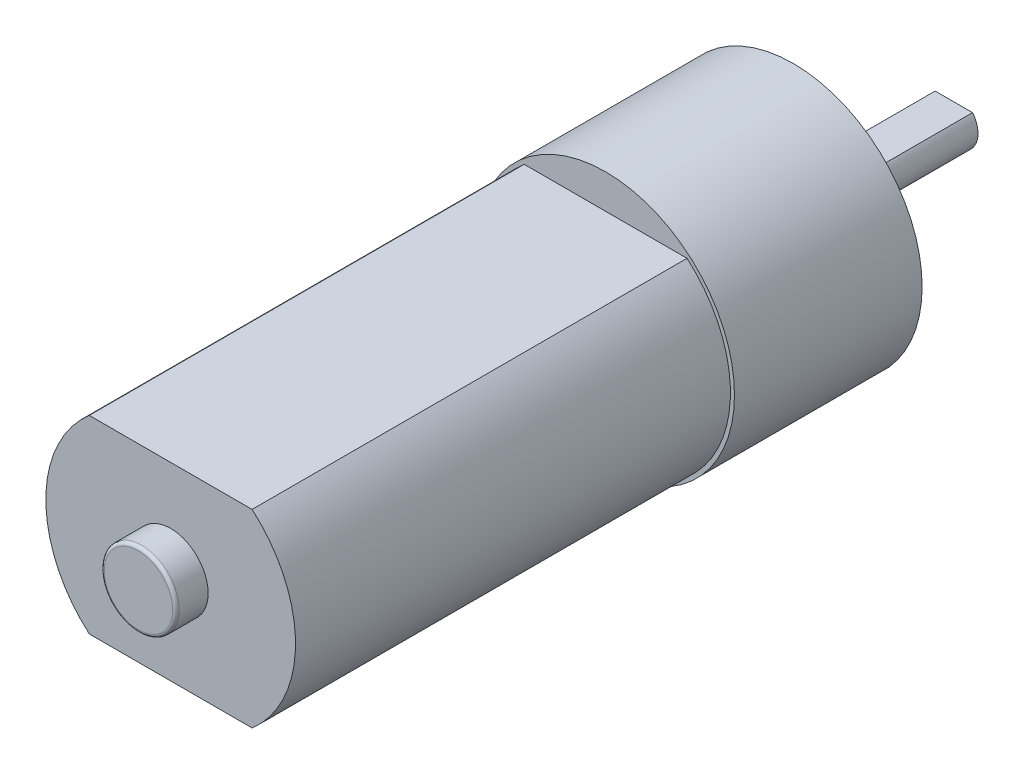
ISO-10303-21;
HEADER;
FILE_DESCRIPTION(('STEP AP214'),'2;1');
FILE_NAME('part.step','',(''),(''),'','','');
FILE_SCHEMA(('AUTOMOTIVE_DESIGN { 1 0 10303 214 1 1 1 1 }'));
ENDSEC;
DATA;
#1=APPLICATION_CONTEXT('core data for automotive mechanical design processes');
#2=APPLICATION_PROTOCOL_DEFINITION('international standard','automotive_design',2000,#1);
#3=PRODUCT_CONTEXT('',#1,'mechanical');
#4=PRODUCT('Part','Part','',(#3));
#5=PRODUCT_RELATED_PRODUCT_CATEGORY('part','',(#4));
#6=PRODUCT_DEFINITION_FORMATION('','',#4);
#7=PRODUCT_DEFINITION_CONTEXT('part definition',#1,'design');
#8=PRODUCT_DEFINITION('design','',#6,#7);
#9=PRODUCT_DEFINITION_SHAPE('','',#8);
#10=(LENGTH_UNIT() NAMED_UNIT(*) SI_UNIT(.MILLI.,.METRE.));
#11=(NAMED_UNIT(*) PLANE_ANGLE_UNIT() SI_UNIT($,.RADIAN.));
#12=(NAMED_UNIT(*) SI_UNIT($,.STERADIAN.) SOLID_ANGLE_UNIT());
#13=UNCERTAINTY_MEASURE_WITH_UNIT(LENGTH_MEASURE(1.E-05),#10,'distance_accuracy_value','');
#14=(GEOMETRIC_REPRESENTATION_CONTEXT(3) GLOBAL_UNCERTAINTY_ASSIGNED_CONTEXT((#13)) GLOBAL_UNIT_ASSIGNED_CONTEXT((#10,
#11,#12)) REPRESENTATION_CONTEXT('',''));
#15=CARTESIAN_POINT('',(0.,0.,0.));
#16=DIRECTION('',(0.,0.,1.));
#17=DIRECTION('',(1.,0.,0.));
#18=AXIS2_PLACEMENT_3D('',#15,#16,#17);
#19=CARTESIAN_POINT('',(0.,0.,38.65));
#20=DIRECTION('',(0.,0.,1.));
#21=DIRECTION('',(1.,0.,0.));
#22=AXIS2_PLACEMENT_3D('',#19,#20,#21);
#23=PLANE('',#22);
#24=CARTESIAN_POINT('',(0.,0.,38.65));
#25=DIRECTION('',(0.,0.,1.));
#26=DIRECTION('',(1.,0.,0.));
#27=AXIS2_PLACEMENT_3D('',#24,#25,#26);
#28=CIRCLE('',#27,7.75);
#29=CARTESIAN_POINT('',(5.05439165478893,-5.875,38.65));
#30=VERTEX_POINT('',#29);
#31=CARTESIAN_POINT('',(5.05439165478893,5.875,38.65));
#32=VERTEX_POINT('',#31);
#33=EDGE_CURVE('E137',#30,#32,#28,.T.);
#34=ORIENTED_EDGE('',*,*,#33,.T.);
#35=DIRECTION('',(-1.,0.,0.));
#36=VECTOR('',#35,1.);
#37=CARTESIAN_POINT('',(-5.05439165478893,5.875,38.65));
#38=LINE('',#37,#36);
#39=CARTESIAN_POINT('',(-5.05439165478893,5.875,38.65));
#40=VERTEX_POINT('',#39);
#41=EDGE_CURVE('E119',#32,#40,#38,.T.);
#42=ORIENTED_EDGE('',*,*,#41,.T.);
#43=CARTESIAN_POINT('',(-5.05439165478893,-5.875,38.65));
#44=VERTEX_POINT('',#43);
#45=EDGE_CURVE('E141',#40,#44,#28,.T.);
#46=ORIENTED_EDGE('',*,*,#45,.T.);
#47=DIRECTION('',(-1.,0.,0.));
#48=VECTOR('',#47,1.);
#49=CARTESIAN_POINT('',(-5.05439165478893,-5.875,38.65));
#50=LINE('',#49,#48);
#51=EDGE_CURVE('E126',#30,#44,#50,.T.);
#52=ORIENTED_EDGE('',*,*,#51,.F.);
#53=EDGE_LOOP('',(#34,#42,#46,#52));
#54=FACE_BOUND('',#53,.T.);
#55=CARTESIAN_POINT('',(0.,0.,38.65));
#56=DIRECTION('',(0.,0.,1.));
#57=DIRECTION('',(1.,0.,0.));
#58=AXIS2_PLACEMENT_3D('',#55,#56,#57);
#59=CIRCLE('',#58,2.325);
#60=CARTESIAN_POINT('',(2.325,0.,38.65));
#61=VERTEX_POINT('',#60);
#62=EDGE_CURVE('E116',#61,#61,#59,.T.);
#63=ORIENTED_EDGE('',*,*,#62,.F.);
#64=EDGE_LOOP('',(#63));
#65=FACE_BOUND('',#64,.T.);
#66=ADVANCED_FACE('F37',(#54,#65),#23,.T.);
#67=CARTESIAN_POINT('',(0.,0.,38.65));
#68=DIRECTION('',(0.,0.,-1.));
#69=DIRECTION('',(-1.,0.,0.));
#70=AXIS2_PLACEMENT_3D('',#67,#68,#69);
#71=CYLINDRICAL_SURFACE('',#70,7.75);
#72=DIRECTION('',(0.,0.,1.));
#73=VECTOR('',#72,1.);
#74=CARTESIAN_POINT('',(5.05439165478893,5.875,11.65));
#75=LINE('',#74,#73);
#76=CARTESIAN_POINT('',(5.05439165478893,5.875,11.65));
#77=VERTEX_POINT('',#76);
#78=EDGE_CURVE('E123',#77,#32,#75,.T.);
#79=ORIENTED_EDGE('',*,*,#78,.T.);
#80=ORIENTED_EDGE('',*,*,#33,.F.);
#81=DIRECTION('',(0.,0.,1.));
#82=VECTOR('',#81,1.);
#83=CARTESIAN_POINT('',(5.05439165478893,-5.875,11.65));
#84=LINE('',#83,#82);
#85=CARTESIAN_POINT('',(5.05439165478893,-5.875,11.65));
#86=VERTEX_POINT('',#85);
#87=EDGE_CURVE('E60',#86,#30,#84,.T.);
#88=ORIENTED_EDGE('',*,*,#87,.F.);
#89=CARTESIAN_POINT('',(0.,0.,11.65));
#90=DIRECTION('',(0.,0.,1.));
#91=DIRECTION('',(1.,0.,0.));
#92=AXIS2_PLACEMENT_3D('',#89,#90,#91);
#93=CIRCLE('',#92,7.75);
#94=EDGE_CURVE('E142',#86,#77,#93,.T.);
#95=ORIENTED_EDGE('',*,*,#94,.T.);
#96=EDGE_LOOP('',(#79,#80,#88,#95));
#97=FACE_BOUND('',#96,.T.);
#98=ADVANCED_FACE('F192',(#97),#71,.T.);
#99=DIRECTION('',(0.,0.,1.));
#100=VECTOR('',#99,1.);
#101=CARTESIAN_POINT('',(-5.05439165478893,5.875,11.65));
#102=LINE('',#101,#100);
#103=CARTESIAN_POINT('',(-5.05439165478893,5.875,11.65));
#104=VERTEX_POINT('',#103);
#105=EDGE_CURVE('E52',#104,#40,#102,.T.);
#106=ORIENTED_EDGE('',*,*,#105,.F.);
#107=CARTESIAN_POINT('',(-5.05439165478893,-5.875,11.65));
#108=VERTEX_POINT('',#107);
#109=EDGE_CURVE('E135',#104,#108,#93,.T.);
#110=ORIENTED_EDGE('',*,*,#109,.T.);
#111=DIRECTION('',(0.,0.,1.));
#112=VECTOR('',#111,1.);
#113=CARTESIAN_POINT('',(-5.05439165478893,-5.875,11.65));
#114=LINE('',#113,#112);
#115=EDGE_CURVE('E132',#108,#44,#114,.T.);
#116=ORIENTED_EDGE('',*,*,#115,.T.);
#117=ORIENTED_EDGE('',*,*,#45,.F.);
#118=EDGE_LOOP('',(#106,#110,#116,#117));
#119=FACE_BOUND('',#118,.T.);
#120=ADVANCED_FACE('F200',(#119),#71,.T.);
#121=CARTESIAN_POINT('',(0.,0.,11.65));
#122=DIRECTION('',(0.,0.,1.));
#123=DIRECTION('',(1.,0.,0.));
#124=AXIS2_PLACEMENT_3D('',#121,#122,#123);
#125=PLANE('',#124);
#126=CARTESIAN_POINT('',(0.,0.,11.65));
#127=DIRECTION('',(0.,0.,1.));
#128=DIRECTION('',(1.,0.,0.));
#129=AXIS2_PLACEMENT_3D('',#126,#127,#128);
#130=CIRCLE('',#129,8.);
#131=CARTESIAN_POINT('',(8.,0.,11.65));
#132=VERTEX_POINT('',#131);
#133=EDGE_CURVE('E164',#132,#132,#130,.T.);
#134=ORIENTED_EDGE('',*,*,#133,.T.);
#135=EDGE_LOOP('',(#134));
#136=FACE_BOUND('',#135,.T.);
#137=ORIENTED_EDGE('',*,*,#109,.F.);
#138=DIRECTION('',(-1.,0.,0.));
#139=VECTOR('',#138,1.);
#140=CARTESIAN_POINT('',(-5.05439165478893,5.875,11.65));
#141=LINE('',#140,#139);
#142=EDGE_CURVE('E120',#77,#104,#141,.T.);
#143=ORIENTED_EDGE('',*,*,#142,.F.);
#144=ORIENTED_EDGE('',*,*,#94,.F.);
#145=DIRECTION('',(-1.,0.,0.));
#146=VECTOR('',#145,1.);
#147=CARTESIAN_POINT('',(-5.05439165478893,-5.875,11.65));
#148=LINE('',#147,#146);
#149=EDGE_CURVE('E128',#86,#108,#148,.T.);
#150=ORIENTED_EDGE('',*,*,#149,.T.);
#151=EDGE_LOOP('',(#137,#143,#144,#150));
#152=FACE_BOUND('',#151,.T.);
#153=ADVANCED_FACE('F229',(#136,#152),#125,.T.);
#154=CARTESIAN_POINT('',(0.,0.,-1.82));
#155=DIRECTION('',(0.,0.,-1.));
#156=DIRECTION('',(-1.,0.,0.));
#157=AXIS2_PLACEMENT_3D('',#154,#155,#156);
#158=PLANE('',#157);
#159=CARTESIAN_POINT('',(0.,0.,-1.82));
#160=DIRECTION('',(0.,0.,-1.));
#161=DIRECTION('',(-1.,0.,0.));
#162=AXIS2_PLACEMENT_3D('',#159,#160,#161);
#163=CIRCLE('',#162,2.975);
#164=CARTESIAN_POINT('',(-2.975,0.,-1.82));
#165=VERTEX_POINT('',#164);
#166=EDGE_CURVE('E158',#165,#165,#163,.T.);
#167=ORIENTED_EDGE('',*,*,#166,.T.);
#168=EDGE_LOOP('',(#167));
#169=FACE_BOUND('',#168,.T.);
#170=CARTESIAN_POINT('',(0.,0.,-1.82));
#171=DIRECTION('',(0.,0.,-1.));
#172=DIRECTION('',(-1.,0.,0.));
#173=AXIS2_PLACEMENT_3D('',#170,#171,#172);
#174=CIRCLE('',#173,1.5);
#175=CARTESIAN_POINT('',(-1.5,0.,-1.82));
#176=VERTEX_POINT('',#175);
#177=EDGE_CURVE('E153',#176,#176,#174,.T.);
#178=ORIENTED_EDGE('',*,*,#177,.F.);
#179=EDGE_LOOP('',(#178));
#180=FACE_BOUND('',#179,.T.);
#181=ADVANCED_FACE('F225',(#169,#180),#158,.T.);
#182=CARTESIAN_POINT('',(0.,0.,0.));
#183=DIRECTION('',(0.,0.,1.));
#184=DIRECTION('',(1.,0.,0.));
#185=AXIS2_PLACEMENT_3D('',#182,#183,#184);
#186=PLANE('',#185);
#187=CARTESIAN_POINT('',(5.5,0.,0.));
#188=DIRECTION('',(0.,0.,-1.));
#189=DIRECTION('',(-1.,0.,0.));
#190=AXIS2_PLACEMENT_3D('',#187,#188,#189);
#191=CIRCLE('',#190,0.799999999999999);
#192=CARTESIAN_POINT('',(4.7,0.,0.));
#193=VERTEX_POINT('',#192);
#194=EDGE_CURVE('E106',#193,#193,#191,.T.);
#195=ORIENTED_EDGE('',*,*,#194,.F.);
#196=EDGE_LOOP('',(#195));
#197=FACE_BOUND('',#196,.T.);
#198=CARTESIAN_POINT('',(-5.5,0.,0.));
#199=DIRECTION('',(0.,0.,-1.));
#200=DIRECTION('',(-1.,0.,0.));
#201=AXIS2_PLACEMENT_3D('',#198,#199,#200);
#202=CIRCLE('',#201,0.799999999999999);
#203=CARTESIAN_POINT('',(-6.3,0.,0.));
#204=VERTEX_POINT('',#203);
#205=EDGE_CURVE('E105',#204,#204,#202,.T.);
#206=ORIENTED_EDGE('',*,*,#205,.F.);
#207=EDGE_LOOP('',(#206));
#208=FACE_BOUND('',#207,.T.);
#209=CARTESIAN_POINT('',(0.,0.,0.));
#210=DIRECTION('',(0.,0.,1.));
#211=DIRECTION('',(1.,0.,0.));
#212=AXIS2_PLACEMENT_3D('',#209,#210,#211);
#213=CIRCLE('',#212,8.);
#214=CARTESIAN_POINT('',(8.,0.,0.));
#215=VERTEX_POINT('',#214);
#216=EDGE_CURVE('E163',#215,#215,#213,.T.);
#217=ORIENTED_EDGE('',*,*,#216,.F.);
#218=EDGE_LOOP('',(#217));
#219=FACE_BOUND('',#218,.T.);
#220=CARTESIAN_POINT('',(0.,0.,0.));
#221=DIRECTION('',(0.,0.,1.));
#222=DIRECTION('',(1.,0.,0.));
#223=AXIS2_PLACEMENT_3D('',#220,#221,#222);
#224=CIRCLE('',#223,2.975);
#225=CARTESIAN_POINT('',(2.975,0.,0.));
#226=VERTEX_POINT('',#225);
#227=EDGE_CURVE('E167',#226,#226,#224,.F.);
#228=ORIENTED_EDGE('',*,*,#227,.F.);
#229=EDGE_LOOP('',(#228));
#230=FACE_BOUND('',#229,.T.);
#231=ADVANCED_FACE('F228',(#197,#208,#219,#230),#186,.F.);
#232=CARTESIAN_POINT('',(0.,0.,11.65));
#233=DIRECTION('',(0.,0.,-1.));
#234=DIRECTION('',(-1.,0.,0.));
#235=AXIS2_PLACEMENT_3D('',#232,#233,#234);
#236=CYLINDRICAL_SURFACE('',#235,8.);
#237=ORIENTED_EDGE('',*,*,#133,.F.);
#238=EDGE_LOOP('',(#237));
#239=FACE_BOUND('',#238,.T.);
#240=ORIENTED_EDGE('',*,*,#216,.T.);
#241=EDGE_LOOP('',(#240));
#242=FACE_BOUND('',#241,.T.);
#243=ADVANCED_FACE('F233',(#239,#242),#236,.T.);
#244=CARTESIAN_POINT('',(0.,0.,-1.82));
#245=DIRECTION('',(0.,0.,1.));
#246=DIRECTION('',(1.,0.,0.));
#247=AXIS2_PLACEMENT_3D('',#244,#245,#246);
#248=CYLINDRICAL_SURFACE('',#247,2.975);
#249=ORIENTED_EDGE('',*,*,#166,.F.);
#250=EDGE_LOOP('',(#249));
#251=FACE_BOUND('',#250,.T.);
#252=ORIENTED_EDGE('',*,*,#227,.T.);
#253=EDGE_LOOP('',(#252));
#254=FACE_BOUND('',#253,.T.);
#255=ADVANCED_FACE('F223',(#251,#254),#248,.T.);
#256=CARTESIAN_POINT('',(0.,0.,-9.97));
#257=DIRECTION('',(0.,0.,1.));
#258=DIRECTION('',(1.,0.,0.));
#259=AXIS2_PLACEMENT_3D('',#256,#257,#258);
#260=CYLINDRICAL_SURFACE('',#259,1.5);
#261=CARTESIAN_POINT('',(0.,0.,-9.97));
#262=DIRECTION('',(0.,0.,-1.));
#263=DIRECTION('',(-1.,0.,0.));
#264=AXIS2_PLACEMENT_3D('',#261,#262,#263);
#265=CIRCLE('',#264,1.5);
#266=CARTESIAN_POINT('',(1.16081867662439,0.95,-9.97));
#267=VERTEX_POINT('',#266);
#268=CARTESIAN_POINT('',(-1.16081867662439,0.95,-9.97));
#269=VERTEX_POINT('',#268);
#270=EDGE_CURVE('E155',#267,#269,#265,.T.);
#271=ORIENTED_EDGE('',*,*,#270,.F.);
#272=DIRECTION('',(0.,0.,-1.));
#273=VECTOR('',#272,1.);
#274=CARTESIAN_POINT('',(1.16081867662439,0.95,-2.97));
#275=LINE('',#274,#273);
#276=CARTESIAN_POINT('',(1.16081867662439,0.95,-2.97));
#277=VERTEX_POINT('',#276);
#278=EDGE_CURVE('E148',#277,#267,#275,.T.);
#279=ORIENTED_EDGE('',*,*,#278,.F.);
#280=CARTESIAN_POINT('',(0.,0.,-2.97));
#281=DIRECTION('',(0.,0.,1.));
#282=DIRECTION('',(1.,0.,0.));
#283=AXIS2_PLACEMENT_3D('',#280,#281,#282);
#284=CIRCLE('',#283,1.5);
#285=CARTESIAN_POINT('',(-1.16081867662439,0.95,-2.97));
#286=VERTEX_POINT('',#285);
#287=EDGE_CURVE('E172',#277,#286,#284,.T.);
#288=ORIENTED_EDGE('',*,*,#287,.T.);
#289=DIRECTION('',(0.,0.,-1.));
#290=VECTOR('',#289,1.);
#291=CARTESIAN_POINT('',(-1.16081867662439,0.95,-2.97));
#292=LINE('',#291,#290);
#293=EDGE_CURVE('E150',#286,#269,#292,.T.);
#294=ORIENTED_EDGE('',*,*,#293,.T.);
#295=EDGE_LOOP('',(#271,#279,#288,#294));
#296=FACE_BOUND('',#295,.T.);
#297=ORIENTED_EDGE('',*,*,#177,.T.);
#298=EDGE_LOOP('',(#297));
#299=FACE_BOUND('',#298,.T.);
#300=ADVANCED_FACE('F219',(#296,#299),#260,.T.);
#301=CARTESIAN_POINT('',(0.,0.,-9.97));
#302=DIRECTION('',(0.,0.,-1.));
#303=DIRECTION('',(-1.,0.,0.));
#304=AXIS2_PLACEMENT_3D('',#301,#302,#303);
#305=PLANE('',#304);
#306=DIRECTION('',(-1.,0.,0.));
#307=VECTOR('',#306,1.);
#308=CARTESIAN_POINT('',(1.16081867662439,0.95,-9.97));
#309=LINE('',#308,#307);
#310=EDGE_CURVE('E140',#267,#269,#309,.T.);
#311=ORIENTED_EDGE('',*,*,#310,.F.);
#312=ORIENTED_EDGE('',*,*,#270,.T.);
#313=EDGE_LOOP('',(#311,#312));
#314=FACE_BOUND('',#313,.T.);
#315=ADVANCED_FACE('F212',(#314),#305,.T.);
#316=CARTESIAN_POINT('',(0.,0.,-2.97));
#317=DIRECTION('',(0.,0.,1.));
#318=DIRECTION('',(1.,0.,0.));
#319=AXIS2_PLACEMENT_3D('',#316,#317,#318);
#320=PLANE('',#319);
#321=DIRECTION('',(-1.,0.,0.));
#322=VECTOR('',#321,1.);
#323=CARTESIAN_POINT('',(1.16081867662439,0.95,-2.97));
#324=LINE('',#323,#322);
#325=EDGE_CURVE('E145',#277,#286,#324,.T.);
#326=ORIENTED_EDGE('',*,*,#325,.T.);
#327=ORIENTED_EDGE('',*,*,#287,.F.);
#328=EDGE_LOOP('',(#326,#327));
#329=FACE_BOUND('',#328,.T.);
#330=ADVANCED_FACE('F208',(#329),#320,.F.);
#331=CARTESIAN_POINT('',(1.16081867662439,0.95,-2.97));
#332=DIRECTION('',(0.,-1.,0.));
#333=DIRECTION('',(0.,0.,-1.));
#334=AXIS2_PLACEMENT_3D('',#331,#332,#333);
#335=PLANE('',#334);
#336=ORIENTED_EDGE('',*,*,#310,.T.);
#337=ORIENTED_EDGE('',*,*,#293,.F.);
#338=ORIENTED_EDGE('',*,*,#325,.F.);
#339=ORIENTED_EDGE('',*,*,#278,.T.);
#340=EDGE_LOOP('',(#336,#337,#338,#339));
#341=FACE_BOUND('',#340,.T.);
#342=ADVANCED_FACE('F211',(#341),#335,.F.);
#343=CARTESIAN_POINT('',(-5.05439165478893,-5.875,11.65));
#344=DIRECTION('',(0.,1.,0.));
#345=DIRECTION('',(0.,0.,1.));
#346=AXIS2_PLACEMENT_3D('',#343,#344,#345);
#347=PLANE('',#346);
#348=ORIENTED_EDGE('',*,*,#51,.T.);
#349=ORIENTED_EDGE('',*,*,#115,.F.);
#350=ORIENTED_EDGE('',*,*,#149,.F.);
#351=ORIENTED_EDGE('',*,*,#87,.T.);
#352=EDGE_LOOP('',(#348,#349,#350,#351));
#353=FACE_BOUND('',#352,.T.);
#354=ADVANCED_FACE('F205',(#353),#347,.F.);
#355=CARTESIAN_POINT('',(-5.05439165478893,5.875,11.65));
#356=DIRECTION('',(0.,1.,0.));
#357=DIRECTION('',(0.,0.,1.));
#358=AXIS2_PLACEMENT_3D('',#355,#356,#357);
#359=PLANE('',#358);
#360=ORIENTED_EDGE('',*,*,#41,.F.);
#361=ORIENTED_EDGE('',*,*,#78,.F.);
#362=ORIENTED_EDGE('',*,*,#142,.T.);
#363=ORIENTED_EDGE('',*,*,#105,.T.);
#364=EDGE_LOOP('',(#360,#361,#362,#363));
#365=FACE_BOUND('',#364,.T.);
#366=ADVANCED_FACE('F260',(#365),#359,.T.);
#367=CARTESIAN_POINT('',(0.,0.,40.65));
#368=DIRECTION('',(0.,0.,-1.));
#369=DIRECTION('',(-1.,0.,0.));
#370=AXIS2_PLACEMENT_3D('',#367,#368,#369);
#371=CYLINDRICAL_SURFACE('',#370,2.325);
#372=CARTESIAN_POINT('',(0.,0.,40.45));
#373=DIRECTION('',(0.,0.,1.));
#374=DIRECTION('',(1.,0.,0.));
#375=AXIS2_PLACEMENT_3D('',#372,#373,#374);
#376=CIRCLE('',#375,2.325);
#377=CARTESIAN_POINT('',(2.325,0.,40.45));
#378=VERTEX_POINT('',#377);
#379=EDGE_CURVE('E11',#378,#378,#376,.F.);
#380=ORIENTED_EDGE('',*,*,#379,.T.);
#381=EDGE_LOOP('',(#380));
#382=FACE_BOUND('',#381,.T.);
#383=ORIENTED_EDGE('',*,*,#62,.T.);
#384=EDGE_LOOP('',(#383));
#385=FACE_BOUND('',#384,.T.);
#386=ADVANCED_FACE('F188',(#382,#385),#371,.T.);
#387=CARTESIAN_POINT('',(0.,0.,40.65));
#388=DIRECTION('',(0.,0.,1.));
#389=DIRECTION('',(1.,0.,0.));
#390=AXIS2_PLACEMENT_3D('',#387,#388,#389);
#391=PLANE('',#390);
#392=CARTESIAN_POINT('',(0.,0.,40.65));
#393=DIRECTION('',(0.,0.,1.));
#394=DIRECTION('',(1.,0.,0.));
#395=AXIS2_PLACEMENT_3D('',#392,#393,#394);
#396=CIRCLE('',#395,2.125);
#397=CARTESIAN_POINT('',(2.125,0.,40.65));
#398=VERTEX_POINT('',#397);
#399=EDGE_CURVE('E45',#398,#398,#396,.T.);
#400=ORIENTED_EDGE('',*,*,#399,.T.);
#401=EDGE_LOOP('',(#400));
#402=FACE_BOUND('',#401,.T.);
#403=ADVANCED_FACE('F177',(#402),#391,.T.);
#404=CARTESIAN_POINT('',(0.,0.,40.45));
#405=DIRECTION('',(0.,0.,1.));
#406=DIRECTION('',(1.,0.,0.));
#407=AXIS2_PLACEMENT_3D('',#404,#405,#406);
#408=TOROIDAL_SURFACE('',#407,2.125,0.2);
#409=ORIENTED_EDGE('',*,*,#379,.F.);
#410=EDGE_LOOP('',(#409));
#411=FACE_BOUND('',#410,.T.);
#412=ORIENTED_EDGE('',*,*,#399,.F.);
#413=EDGE_LOOP('',(#412));
#414=FACE_BOUND('',#413,.T.);
#415=ADVANCED_FACE('F39',(#411,#414),#408,.T.);
#416=CARTESIAN_POINT('',(-5.5,0.,3.));
#417=DIRECTION('',(0.,0.,-1.));
#418=DIRECTION('',(-1.,0.,0.));
#419=AXIS2_PLACEMENT_3D('',#416,#417,#418);
#420=CONICAL_SURFACE('',#419,0.799999999999999,1.02974425867665);
#421=CARTESIAN_POINT('',(-5.5,0.,3.48068849522205));
#422=VERTEX_POINT('',#421);
#423=VERTEX_LOOP('',#422);
#424=FACE_BOUND('',#423,.T.);
#425=CARTESIAN_POINT('',(-5.5,0.,3.));
#426=DIRECTION('',(0.,0.,-1.));
#427=DIRECTION('',(-1.,0.,0.));
#428=AXIS2_PLACEMENT_3D('',#425,#426,#427);
#429=CIRCLE('',#428,0.799999999999999);
#430=CARTESIAN_POINT('',(-6.3,0.,3.));
#431=VERTEX_POINT('',#430);
#432=EDGE_CURVE('E109',#431,#431,#429,.T.);
#433=ORIENTED_EDGE('',*,*,#432,.T.);
#434=EDGE_LOOP('',(#433));
#435=FACE_BOUND('',#434,.T.);
#436=ADVANCED_FACE('F180',(#424,#435),#420,.F.);
#437=CARTESIAN_POINT('',(-5.5,0.,0.));
#438=DIRECTION('',(0.,0.,-1.));
#439=DIRECTION('',(-1.,0.,0.));
#440=AXIS2_PLACEMENT_3D('',#437,#438,#439);
#441=CYLINDRICAL_SURFACE('',#440,0.799999999999999);
#442=ORIENTED_EDGE('',*,*,#432,.F.);
#443=EDGE_LOOP('',(#442));
#444=FACE_BOUND('',#443,.T.);
#445=ORIENTED_EDGE('',*,*,#205,.T.);
#446=EDGE_LOOP('',(#445));
#447=FACE_BOUND('',#446,.T.);
#448=ADVANCED_FACE('F99',(#444,#447),#441,.F.);
#449=CARTESIAN_POINT('',(5.5,0.,3.));
#450=DIRECTION('',(0.,0.,-1.));
#451=DIRECTION('',(-1.,0.,0.));
#452=AXIS2_PLACEMENT_3D('',#449,#450,#451);
#453=CONICAL_SURFACE('',#452,0.799999999999999,1.02974425867665);
#454=CARTESIAN_POINT('',(5.5,0.,3.48068849522205));
#455=VERTEX_POINT('',#454);
#456=VERTEX_LOOP('',#455);
#457=FACE_BOUND('',#456,.T.);
#458=CARTESIAN_POINT('',(5.5,0.,3.));
#459=DIRECTION('',(0.,0.,-1.));
#460=DIRECTION('',(-1.,0.,0.));
#461=AXIS2_PLACEMENT_3D('',#458,#459,#460);
#462=CIRCLE('',#461,0.799999999999999);
#463=CARTESIAN_POINT('',(4.7,0.,3.));
#464=VERTEX_POINT('',#463);
#465=EDGE_CURVE('E103',#464,#464,#462,.T.);
#466=ORIENTED_EDGE('',*,*,#465,.T.);
#467=EDGE_LOOP('',(#466));
#468=FACE_BOUND('',#467,.T.);
#469=ADVANCED_FACE('F95',(#457,#468),#453,.F.);
#470=CARTESIAN_POINT('',(5.5,0.,0.));
#471=DIRECTION('',(0.,0.,-1.));
#472=DIRECTION('',(-1.,0.,0.));
#473=AXIS2_PLACEMENT_3D('',#470,#471,#472);
#474=CYLINDRICAL_SURFACE('',#473,0.799999999999999);
#475=ORIENTED_EDGE('',*,*,#465,.F.);
#476=EDGE_LOOP('',(#475));
#477=FACE_BOUND('',#476,.T.);
#478=ORIENTED_EDGE('',*,*,#194,.T.);
#479=EDGE_LOOP('',(#478));
#480=FACE_BOUND('',#479,.T.);
#481=ADVANCED_FACE('F98',(#477,#480),#474,.F.);
#482=CLOSED_SHELL('',(#66,#98,#120,#153,#181,#231,#243,#255,#300,#315,#330,#342,#354,#366,#386,
#403,#415,#436,#448,#469,#481));
#483=MANIFOLD_SOLID_BREP('B2',#482);
#484=ADVANCED_BREP_SHAPE_REPRESENTATION('',(#18,#483),#14);
#485=SHAPE_DEFINITION_REPRESENTATION(#9,#484);
ENDSEC;
END-ISO-10303-21;
